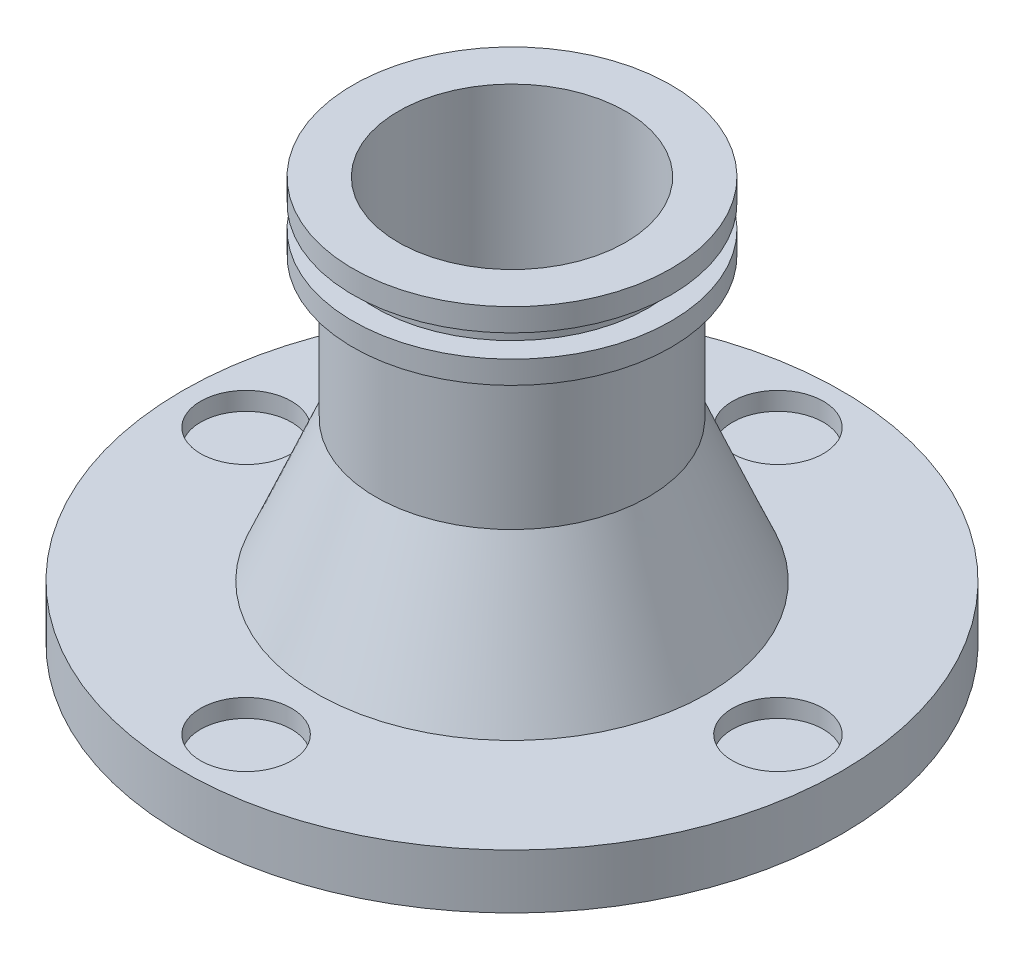
ISO-10303-21;
HEADER;
FILE_DESCRIPTION(('STEP AP214'),'2;1');
FILE_NAME('part.step','',(''),(''),'','','');
FILE_SCHEMA(('AUTOMOTIVE_DESIGN { 1 0 10303 214 1 1 1 1 }'));
ENDSEC;
DATA;
#1=APPLICATION_CONTEXT('core data for automotive mechanical design processes');
#2=APPLICATION_PROTOCOL_DEFINITION('international standard','automotive_design',2000,#1);
#3=PRODUCT_CONTEXT('',#1,'mechanical');
#4=PRODUCT('Part','Part','',(#3));
#5=PRODUCT_RELATED_PRODUCT_CATEGORY('part','',(#4));
#6=PRODUCT_DEFINITION_FORMATION('','',#4);
#7=PRODUCT_DEFINITION_CONTEXT('part definition',#1,'design');
#8=PRODUCT_DEFINITION('design','',#6,#7);
#9=PRODUCT_DEFINITION_SHAPE('','',#8);
#10=(LENGTH_UNIT() NAMED_UNIT(*) SI_UNIT(.MILLI.,.METRE.));
#11=(NAMED_UNIT(*) PLANE_ANGLE_UNIT() SI_UNIT($,.RADIAN.));
#12=(NAMED_UNIT(*) SI_UNIT($,.STERADIAN.) SOLID_ANGLE_UNIT());
#13=UNCERTAINTY_MEASURE_WITH_UNIT(LENGTH_MEASURE(1.E-05),#10,'distance_accuracy_value','');
#14=(GEOMETRIC_REPRESENTATION_CONTEXT(3) GLOBAL_UNCERTAINTY_ASSIGNED_CONTEXT((#13)) GLOBAL_UNIT_ASSIGNED_CONTEXT((#10,
#11,#12)) REPRESENTATION_CONTEXT('',''));
#15=CARTESIAN_POINT('',(0.,0.,0.));
#16=DIRECTION('',(0.,0.,1.));
#17=DIRECTION('',(1.,0.,0.));
#18=AXIS2_PLACEMENT_3D('',#15,#16,#17);
#19=CARTESIAN_POINT('',(0.,0.,0.));
#20=DIRECTION('',(0.,-1.,0.));
#21=DIRECTION('',(1.,0.,0.));
#22=AXIS2_PLACEMENT_3D('',#19,#20,#21);
#23=CYLINDRICAL_SURFACE('',#22,25.);
#24=CARTESIAN_POINT('',(0.,89.,0.));
#25=DIRECTION('',(0.,-1.,0.));
#26=DIRECTION('',(1.,0.,0.));
#27=AXIS2_PLACEMENT_3D('',#24,#25,#26);
#28=CIRCLE('',#27,25.);
#29=CARTESIAN_POINT('',(25.,89.,0.));
#30=VERTEX_POINT('',#29);
#31=EDGE_CURVE('E10',#30,#30,#28,.T.);
#32=ORIENTED_EDGE('',*,*,#31,.F.);
#33=EDGE_LOOP('',(#32));
#34=FACE_BOUND('',#33,.T.);
#35=CARTESIAN_POINT('',(0.,43.,0.));
#36=DIRECTION('',(0.,-1.,0.));
#37=DIRECTION('',(1.,0.,0.));
#38=AXIS2_PLACEMENT_3D('',#35,#36,#37);
#39=CIRCLE('',#38,25.);
#40=CARTESIAN_POINT('',(25.,43.,0.));
#41=VERTEX_POINT('',#40);
#42=EDGE_CURVE('E76',#41,#41,#39,.T.);
#43=ORIENTED_EDGE('',*,*,#42,.T.);
#44=EDGE_LOOP('',(#43));
#45=FACE_BOUND('',#44,.T.);
#46=ADVANCED_FACE('F30',(#34,#45),#23,.F.);
#47=CARTESIAN_POINT('',(-25.,89.,0.));
#48=DIRECTION('',(0.,-1.,0.));
#49=DIRECTION('',(1.,0.,0.));
#50=AXIS2_PLACEMENT_3D('',#47,#48,#49);
#51=PLANE('',#50);
#52=CARTESIAN_POINT('',(0.,89.,0.));
#53=DIRECTION('',(0.,-1.,0.));
#54=DIRECTION('',(1.,0.,0.));
#55=AXIS2_PLACEMENT_3D('',#52,#53,#54);
#56=CIRCLE('',#55,35.);
#57=CARTESIAN_POINT('',(35.,89.,0.));
#58=VERTEX_POINT('',#57);
#59=EDGE_CURVE('E36',#58,#58,#56,.T.);
#60=ORIENTED_EDGE('',*,*,#59,.F.);
#61=EDGE_LOOP('',(#60));
#62=FACE_BOUND('',#61,.T.);
#63=ORIENTED_EDGE('',*,*,#31,.T.);
#64=EDGE_LOOP('',(#63));
#65=FACE_BOUND('',#64,.T.);
#66=ADVANCED_FACE('F172',(#62,#65),#51,.F.);
#67=CARTESIAN_POINT('',(0.,0.,0.));
#68=DIRECTION('',(0.,-1.,0.));
#69=DIRECTION('',(1.,0.,0.));
#70=AXIS2_PLACEMENT_3D('',#67,#68,#69);
#71=CYLINDRICAL_SURFACE('',#70,35.);
#72=CARTESIAN_POINT('',(0.,84.,0.));
#73=DIRECTION('',(0.,-1.,0.));
#74=DIRECTION('',(1.,0.,0.));
#75=AXIS2_PLACEMENT_3D('',#72,#73,#74);
#76=CIRCLE('',#75,35.);
#77=CARTESIAN_POINT('',(35.,84.,0.));
#78=VERTEX_POINT('',#77);
#79=EDGE_CURVE('E40',#78,#78,#76,.T.);
#80=ORIENTED_EDGE('',*,*,#79,.F.);
#81=EDGE_LOOP('',(#80));
#82=FACE_BOUND('',#81,.T.);
#83=ORIENTED_EDGE('',*,*,#59,.T.);
#84=EDGE_LOOP('',(#83));
#85=FACE_BOUND('',#84,.T.);
#86=ADVANCED_FACE('F167',(#82,#85),#71,.T.);
#87=CARTESIAN_POINT('',(-35.,84.,0.));
#88=DIRECTION('',(0.,1.,0.));
#89=DIRECTION('',(-1.,0.,0.));
#90=AXIS2_PLACEMENT_3D('',#87,#88,#89);
#91=PLANE('',#90);
#92=CARTESIAN_POINT('',(0.,84.,0.));
#93=DIRECTION('',(0.,-1.,0.));
#94=DIRECTION('',(1.,0.,0.));
#95=AXIS2_PLACEMENT_3D('',#92,#93,#94);
#96=CIRCLE('',#95,30.);
#97=CARTESIAN_POINT('',(30.,84.,0.));
#98=VERTEX_POINT('',#97);
#99=EDGE_CURVE('E44',#98,#98,#96,.T.);
#100=ORIENTED_EDGE('',*,*,#99,.F.);
#101=EDGE_LOOP('',(#100));
#102=FACE_BOUND('',#101,.T.);
#103=ORIENTED_EDGE('',*,*,#79,.T.);
#104=EDGE_LOOP('',(#103));
#105=FACE_BOUND('',#104,.T.);
#106=ADVANCED_FACE('F161',(#102,#105),#91,.F.);
#107=CARTESIAN_POINT('',(0.,0.,0.));
#108=DIRECTION('',(0.,-1.,0.));
#109=DIRECTION('',(1.,0.,0.));
#110=AXIS2_PLACEMENT_3D('',#107,#108,#109);
#111=CYLINDRICAL_SURFACE('',#110,30.);
#112=CARTESIAN_POINT('',(0.,79.,0.));
#113=DIRECTION('',(0.,-1.,0.));
#114=DIRECTION('',(1.,0.,0.));
#115=AXIS2_PLACEMENT_3D('',#112,#113,#114);
#116=CIRCLE('',#115,30.);
#117=CARTESIAN_POINT('',(30.,79.,0.));
#118=VERTEX_POINT('',#117);
#119=EDGE_CURVE('E49',#118,#118,#116,.T.);
#120=ORIENTED_EDGE('',*,*,#119,.F.);
#121=EDGE_LOOP('',(#120));
#122=FACE_BOUND('',#121,.T.);
#123=ORIENTED_EDGE('',*,*,#99,.T.);
#124=EDGE_LOOP('',(#123));
#125=FACE_BOUND('',#124,.T.);
#126=ADVANCED_FACE('F155',(#122,#125),#111,.T.);
#127=CARTESIAN_POINT('',(-30.,79.,0.));
#128=DIRECTION('',(0.,-1.,0.));
#129=DIRECTION('',(1.,0.,0.));
#130=AXIS2_PLACEMENT_3D('',#127,#128,#129);
#131=PLANE('',#130);
#132=CARTESIAN_POINT('',(0.,79.,0.));
#133=DIRECTION('',(0.,-1.,0.));
#134=DIRECTION('',(1.,0.,0.));
#135=AXIS2_PLACEMENT_3D('',#132,#133,#134);
#136=CIRCLE('',#135,35.);
#137=CARTESIAN_POINT('',(35.,79.,0.));
#138=VERTEX_POINT('',#137);
#139=EDGE_CURVE('E52',#138,#138,#136,.T.);
#140=ORIENTED_EDGE('',*,*,#139,.F.);
#141=EDGE_LOOP('',(#140));
#142=FACE_BOUND('',#141,.T.);
#143=ORIENTED_EDGE('',*,*,#119,.T.);
#144=EDGE_LOOP('',(#143));
#145=FACE_BOUND('',#144,.T.);
#146=ADVANCED_FACE('F149',(#142,#145),#131,.F.);
#147=CARTESIAN_POINT('',(0.,0.,0.));
#148=DIRECTION('',(0.,-1.,0.));
#149=DIRECTION('',(1.,0.,0.));
#150=AXIS2_PLACEMENT_3D('',#147,#148,#149);
#151=CYLINDRICAL_SURFACE('',#150,35.);
#152=CARTESIAN_POINT('',(0.,74.,0.));
#153=DIRECTION('',(0.,-1.,0.));
#154=DIRECTION('',(1.,0.,0.));
#155=AXIS2_PLACEMENT_3D('',#152,#153,#154);
#156=CIRCLE('',#155,35.);
#157=CARTESIAN_POINT('',(35.,74.,0.));
#158=VERTEX_POINT('',#157);
#159=EDGE_CURVE('E55',#158,#158,#156,.T.);
#160=ORIENTED_EDGE('',*,*,#159,.F.);
#161=EDGE_LOOP('',(#160));
#162=FACE_BOUND('',#161,.T.);
#163=ORIENTED_EDGE('',*,*,#139,.T.);
#164=EDGE_LOOP('',(#163));
#165=FACE_BOUND('',#164,.T.);
#166=ADVANCED_FACE('F143',(#162,#165),#151,.T.);
#167=CARTESIAN_POINT('',(-35.,74.,0.));
#168=DIRECTION('',(0.,1.,0.));
#169=DIRECTION('',(-1.,0.,0.));
#170=AXIS2_PLACEMENT_3D('',#167,#168,#169);
#171=PLANE('',#170);
#172=CARTESIAN_POINT('',(0.,74.,0.));
#173=DIRECTION('',(0.,-1.,0.));
#174=DIRECTION('',(1.,0.,0.));
#175=AXIS2_PLACEMENT_3D('',#172,#173,#174);
#176=CIRCLE('',#175,30.);
#177=CARTESIAN_POINT('',(30.,74.,0.));
#178=VERTEX_POINT('',#177);
#179=EDGE_CURVE('E58',#178,#178,#176,.T.);
#180=ORIENTED_EDGE('',*,*,#179,.F.);
#181=EDGE_LOOP('',(#180));
#182=FACE_BOUND('',#181,.T.);
#183=ORIENTED_EDGE('',*,*,#159,.T.);
#184=EDGE_LOOP('',(#183));
#185=FACE_BOUND('',#184,.T.);
#186=ADVANCED_FACE('F137',(#182,#185),#171,.F.);
#187=CARTESIAN_POINT('',(0.,0.,0.));
#188=DIRECTION('',(0.,-1.,0.));
#189=DIRECTION('',(1.,0.,0.));
#190=AXIS2_PLACEMENT_3D('',#187,#188,#189);
#191=CYLINDRICAL_SURFACE('',#190,30.);
#192=CARTESIAN_POINT('',(0.,43.,0.));
#193=DIRECTION('',(0.,-1.,0.));
#194=DIRECTION('',(1.,0.,0.));
#195=AXIS2_PLACEMENT_3D('',#192,#193,#194);
#196=CIRCLE('',#195,30.);
#197=CARTESIAN_POINT('',(30.,43.,0.));
#198=VERTEX_POINT('',#197);
#199=EDGE_CURVE('E61',#198,#198,#196,.T.);
#200=ORIENTED_EDGE('',*,*,#199,.F.);
#201=EDGE_LOOP('',(#200));
#202=FACE_BOUND('',#201,.T.);
#203=ORIENTED_EDGE('',*,*,#179,.T.);
#204=EDGE_LOOP('',(#203));
#205=FACE_BOUND('',#204,.T.);
#206=ADVANCED_FACE('F131',(#202,#205),#191,.T.);
#207=CARTESIAN_POINT('',(0.,43.,0.));
#208=DIRECTION('',(0.,-1.,0.));
#209=DIRECTION('',(1.,0.,0.));
#210=AXIS2_PLACEMENT_3D('',#207,#208,#209);
#211=CONICAL_SURFACE('',#210,30.,0.396441283218441);
#212=CARTESIAN_POINT('',(0.,12.,0.));
#213=DIRECTION('',(0.,-1.,0.));
#214=DIRECTION('',(1.,0.,0.));
#215=AXIS2_PLACEMENT_3D('',#212,#213,#214);
#216=CIRCLE('',#215,42.9767441860465);
#217=CARTESIAN_POINT('',(42.9767441860465,12.,0.));
#218=VERTEX_POINT('',#217);
#219=EDGE_CURVE('E64',#218,#218,#216,.T.);
#220=ORIENTED_EDGE('',*,*,#219,.F.);
#221=EDGE_LOOP('',(#220));
#222=FACE_BOUND('',#221,.T.);
#223=ORIENTED_EDGE('',*,*,#199,.T.);
#224=EDGE_LOOP('',(#223));
#225=FACE_BOUND('',#224,.T.);
#226=ADVANCED_FACE('F117',(#222,#225),#211,.T.);
#227=CARTESIAN_POINT('',(-42.9767441860465,12.,0.));
#228=DIRECTION('',(0.,-1.,0.));
#229=DIRECTION('',(1.,0.,0.));
#230=AXIS2_PLACEMENT_3D('',#227,#228,#229);
#231=PLANE('',#230);
#232=CARTESIAN_POINT('',(0.,12.,-58.5));
#233=DIRECTION('',(0.,1.,0.));
#234=DIRECTION('',(-1.,0.,0.));
#235=AXIS2_PLACEMENT_3D('',#232,#233,#234);
#236=CIRCLE('',#235,10.);
#237=CARTESIAN_POINT('',(-10.,12.,-58.5));
#238=VERTEX_POINT('',#237);
#239=EDGE_CURVE('E98',#238,#238,#236,.T.);
#240=ORIENTED_EDGE('',*,*,#239,.F.);
#241=EDGE_LOOP('',(#240));
#242=FACE_BOUND('',#241,.T.);
#243=CARTESIAN_POINT('',(58.5,12.,0.));
#244=DIRECTION('',(0.,1.,0.));
#245=DIRECTION('',(-1.,0.,0.));
#246=AXIS2_PLACEMENT_3D('',#243,#244,#245);
#247=CIRCLE('',#246,10.0000000000002);
#248=CARTESIAN_POINT('',(48.4999999999998,12.,0.));
#249=VERTEX_POINT('',#248);
#250=EDGE_CURVE('E92',#249,#249,#247,.T.);
#251=ORIENTED_EDGE('',*,*,#250,.F.);
#252=EDGE_LOOP('',(#251));
#253=FACE_BOUND('',#252,.T.);
#254=CARTESIAN_POINT('',(0.,12.,58.5));
#255=DIRECTION('',(0.,1.,0.));
#256=DIRECTION('',(-1.,0.,0.));
#257=AXIS2_PLACEMENT_3D('',#254,#255,#256);
#258=CIRCLE('',#257,10.0000000000004);
#259=CARTESIAN_POINT('',(-10.0000000000004,12.,58.5));
#260=VERTEX_POINT('',#259);
#261=EDGE_CURVE('E86',#260,#260,#258,.T.);
#262=ORIENTED_EDGE('',*,*,#261,.F.);
#263=EDGE_LOOP('',(#262));
#264=FACE_BOUND('',#263,.T.);
#265=CARTESIAN_POINT('',(-58.5,12.,0.));
#266=DIRECTION('',(0.,1.,0.));
#267=DIRECTION('',(-1.,0.,0.));
#268=AXIS2_PLACEMENT_3D('',#265,#266,#267);
#269=CIRCLE('',#268,10.0000000000006);
#270=CARTESIAN_POINT('',(-68.5000000000006,12.,0.));
#271=VERTEX_POINT('',#270);
#272=EDGE_CURVE('E80',#271,#271,#269,.T.);
#273=ORIENTED_EDGE('',*,*,#272,.F.);
#274=EDGE_LOOP('',(#273));
#275=FACE_BOUND('',#274,.T.);
#276=CARTESIAN_POINT('',(0.,12.,0.));
#277=DIRECTION('',(0.,-1.,0.));
#278=DIRECTION('',(1.,0.,0.));
#279=AXIS2_PLACEMENT_3D('',#276,#277,#278);
#280=CIRCLE('',#279,72.5);
#281=CARTESIAN_POINT('',(72.5,12.,0.));
#282=VERTEX_POINT('',#281);
#283=EDGE_CURVE('E67',#282,#282,#280,.T.);
#284=ORIENTED_EDGE('',*,*,#283,.F.);
#285=EDGE_LOOP('',(#284));
#286=FACE_BOUND('',#285,.T.);
#287=ORIENTED_EDGE('',*,*,#219,.T.);
#288=EDGE_LOOP('',(#287));
#289=FACE_BOUND('',#288,.T.);
#290=ADVANCED_FACE('F113',(#242,#253,#264,#275,#286,#289),#231,.F.);
#291=CARTESIAN_POINT('',(0.,0.,0.));
#292=DIRECTION('',(0.,-1.,0.));
#293=DIRECTION('',(1.,0.,0.));
#294=AXIS2_PLACEMENT_3D('',#291,#292,#293);
#295=CYLINDRICAL_SURFACE('',#294,72.5);
#296=CARTESIAN_POINT('',(0.,0.,0.));
#297=DIRECTION('',(0.,-1.,0.));
#298=DIRECTION('',(1.,0.,0.));
#299=AXIS2_PLACEMENT_3D('',#296,#297,#298);
#300=CIRCLE('',#299,72.5);
#301=CARTESIAN_POINT('',(72.5,0.,0.));
#302=VERTEX_POINT('',#301);
#303=EDGE_CURVE('E70',#302,#302,#300,.T.);
#304=ORIENTED_EDGE('',*,*,#303,.F.);
#305=EDGE_LOOP('',(#304));
#306=FACE_BOUND('',#305,.T.);
#307=ORIENTED_EDGE('',*,*,#283,.T.);
#308=EDGE_LOOP('',(#307));
#309=FACE_BOUND('',#308,.T.);
#310=ADVANCED_FACE('F116',(#306,#309),#295,.T.);
#311=CARTESIAN_POINT('',(-72.5,0.,0.));
#312=DIRECTION('',(0.,1.,0.));
#313=DIRECTION('',(-1.,0.,0.));
#314=AXIS2_PLACEMENT_3D('',#311,#312,#313);
#315=PLANE('',#314);
#316=CARTESIAN_POINT('',(0.,0.,0.));
#317=DIRECTION('',(0.,-1.,0.));
#318=DIRECTION('',(1.,0.,0.));
#319=AXIS2_PLACEMENT_3D('',#316,#317,#318);
#320=CIRCLE('',#319,43.);
#321=CARTESIAN_POINT('',(43.,0.,0.));
#322=VERTEX_POINT('',#321);
#323=EDGE_CURVE('E73',#322,#322,#320,.T.);
#324=ORIENTED_EDGE('',*,*,#323,.F.);
#325=EDGE_LOOP('',(#324));
#326=FACE_BOUND('',#325,.T.);
#327=ORIENTED_EDGE('',*,*,#303,.T.);
#328=EDGE_LOOP('',(#327));
#329=FACE_BOUND('',#328,.T.);
#330=ADVANCED_FACE('F189',(#326,#329),#315,.F.);
#331=CARTESIAN_POINT('',(0.,0.,0.));
#332=DIRECTION('',(0.,-1.,0.));
#333=DIRECTION('',(1.,0.,0.));
#334=AXIS2_PLACEMENT_3D('',#331,#332,#333);
#335=CONICAL_SURFACE('',#334,43.,0.396441283218441);
#336=ORIENTED_EDGE('',*,*,#42,.F.);
#337=EDGE_LOOP('',(#336));
#338=FACE_BOUND('',#337,.T.);
#339=ORIENTED_EDGE('',*,*,#323,.T.);
#340=EDGE_LOOP('',(#339));
#341=FACE_BOUND('',#340,.T.);
#342=ADVANCED_FACE('F185',(#338,#341),#335,.F.);
#343=CARTESIAN_POINT('',(-58.5,8.,0.));
#344=DIRECTION('',(0.,1.,0.));
#345=DIRECTION('',(-1.,0.,0.));
#346=AXIS2_PLACEMENT_3D('',#343,#344,#345);
#347=CYLINDRICAL_SURFACE('',#346,10.0000000000006);
#348=CARTESIAN_POINT('',(-58.5,8.,0.));
#349=DIRECTION('',(0.,1.,0.));
#350=DIRECTION('',(-1.,0.,0.));
#351=AXIS2_PLACEMENT_3D('',#348,#349,#350);
#352=CIRCLE('',#351,10.0000000000006);
#353=CARTESIAN_POINT('',(-68.5000000000006,8.,0.));
#354=VERTEX_POINT('',#353);
#355=EDGE_CURVE('E83',#354,#354,#352,.T.);
#356=ORIENTED_EDGE('',*,*,#355,.F.);
#357=EDGE_LOOP('',(#356));
#358=FACE_BOUND('',#357,.T.);
#359=ORIENTED_EDGE('',*,*,#272,.T.);
#360=EDGE_LOOP('',(#359));
#361=FACE_BOUND('',#360,.T.);
#362=ADVANCED_FACE('F188',(#358,#361),#347,.F.);
#363=CARTESIAN_POINT('',(-58.5,8.,0.));
#364=DIRECTION('',(0.,1.,0.));
#365=DIRECTION('',(-1.,0.,0.));
#366=AXIS2_PLACEMENT_3D('',#363,#364,#365);
#367=PLANE('',#366);
#368=ORIENTED_EDGE('',*,*,#355,.T.);
#369=EDGE_LOOP('',(#368));
#370=FACE_BOUND('',#369,.T.);
#371=ADVANCED_FACE('F206',(#370),#367,.T.);
#372=CARTESIAN_POINT('',(0.,8.,58.5));
#373=DIRECTION('',(0.,1.,0.));
#374=DIRECTION('',(-1.,0.,0.));
#375=AXIS2_PLACEMENT_3D('',#372,#373,#374);
#376=CYLINDRICAL_SURFACE('',#375,10.0000000000004);
#377=CARTESIAN_POINT('',(0.,8.,58.5));
#378=DIRECTION('',(0.,1.,0.));
#379=DIRECTION('',(-1.,0.,0.));
#380=AXIS2_PLACEMENT_3D('',#377,#378,#379);
#381=CIRCLE('',#380,10.0000000000004);
#382=CARTESIAN_POINT('',(-10.0000000000004,8.,58.5));
#383=VERTEX_POINT('',#382);
#384=EDGE_CURVE('E89',#383,#383,#381,.T.);
#385=ORIENTED_EDGE('',*,*,#384,.F.);
#386=EDGE_LOOP('',(#385));
#387=FACE_BOUND('',#386,.T.);
#388=ORIENTED_EDGE('',*,*,#261,.T.);
#389=EDGE_LOOP('',(#388));
#390=FACE_BOUND('',#389,.T.);
#391=ADVANCED_FACE('F210',(#387,#390),#376,.F.);
#392=CARTESIAN_POINT('',(0.,8.,58.5));
#393=DIRECTION('',(0.,1.,0.));
#394=DIRECTION('',(-1.,0.,0.));
#395=AXIS2_PLACEMENT_3D('',#392,#393,#394);
#396=PLANE('',#395);
#397=ORIENTED_EDGE('',*,*,#384,.T.);
#398=EDGE_LOOP('',(#397));
#399=FACE_BOUND('',#398,.T.);
#400=ADVANCED_FACE('F214',(#399),#396,.T.);
#401=CARTESIAN_POINT('',(58.5,8.,0.));
#402=DIRECTION('',(0.,1.,0.));
#403=DIRECTION('',(-1.,0.,0.));
#404=AXIS2_PLACEMENT_3D('',#401,#402,#403);
#405=CYLINDRICAL_SURFACE('',#404,10.0000000000002);
#406=CARTESIAN_POINT('',(58.5,8.,0.));
#407=DIRECTION('',(0.,1.,0.));
#408=DIRECTION('',(-1.,0.,0.));
#409=AXIS2_PLACEMENT_3D('',#406,#407,#408);
#410=CIRCLE('',#409,10.0000000000002);
#411=CARTESIAN_POINT('',(48.4999999999998,8.,0.));
#412=VERTEX_POINT('',#411);
#413=EDGE_CURVE('E95',#412,#412,#410,.T.);
#414=ORIENTED_EDGE('',*,*,#413,.F.);
#415=EDGE_LOOP('',(#414));
#416=FACE_BOUND('',#415,.T.);
#417=ORIENTED_EDGE('',*,*,#250,.T.);
#418=EDGE_LOOP('',(#417));
#419=FACE_BOUND('',#418,.T.);
#420=ADVANCED_FACE('F218',(#416,#419),#405,.F.);
#421=CARTESIAN_POINT('',(58.5,8.,0.));
#422=DIRECTION('',(0.,1.,0.));
#423=DIRECTION('',(-1.,0.,0.));
#424=AXIS2_PLACEMENT_3D('',#421,#422,#423);
#425=PLANE('',#424);
#426=ORIENTED_EDGE('',*,*,#413,.T.);
#427=EDGE_LOOP('',(#426));
#428=FACE_BOUND('',#427,.T.);
#429=ADVANCED_FACE('F109',(#428),#425,.T.);
#430=CARTESIAN_POINT('',(0.,8.,-58.5));
#431=DIRECTION('',(0.,1.,0.));
#432=DIRECTION('',(-1.,0.,0.));
#433=AXIS2_PLACEMENT_3D('',#430,#431,#432);
#434=CYLINDRICAL_SURFACE('',#433,10.);
#435=CARTESIAN_POINT('',(0.,8.,-58.5));
#436=DIRECTION('',(0.,1.,0.));
#437=DIRECTION('',(-1.,0.,0.));
#438=AXIS2_PLACEMENT_3D('',#435,#436,#437);
#439=CIRCLE('',#438,10.);
#440=CARTESIAN_POINT('',(-10.,8.,-58.5));
#441=VERTEX_POINT('',#440);
#442=EDGE_CURVE('E79',#441,#441,#439,.T.);
#443=ORIENTED_EDGE('',*,*,#442,.F.);
#444=EDGE_LOOP('',(#443));
#445=FACE_BOUND('',#444,.T.);
#446=ORIENTED_EDGE('',*,*,#239,.T.);
#447=EDGE_LOOP('',(#446));
#448=FACE_BOUND('',#447,.T.);
#449=ADVANCED_FACE('F106',(#445,#448),#434,.F.);
#450=CARTESIAN_POINT('',(0.,8.,-58.5));
#451=DIRECTION('',(0.,1.,0.));
#452=DIRECTION('',(-1.,0.,0.));
#453=AXIS2_PLACEMENT_3D('',#450,#451,#452);
#454=PLANE('',#453);
#455=ORIENTED_EDGE('',*,*,#442,.T.);
#456=EDGE_LOOP('',(#455));
#457=FACE_BOUND('',#456,.T.);
#458=ADVANCED_FACE('F104',(#457),#454,.T.);
#459=CLOSED_SHELL('',(#46,#66,#86,#106,#126,#146,#166,#186,#206,#226,#290,#310,#330,#342,#362,
#371,#391,#400,#420,#429,#449,#458));
#460=MANIFOLD_SOLID_BREP('B2',#459);
#461=ADVANCED_BREP_SHAPE_REPRESENTATION('',(#18,#460),#14);
#462=SHAPE_DEFINITION_REPRESENTATION(#9,#461);
ENDSEC;
END-ISO-10303-21;
